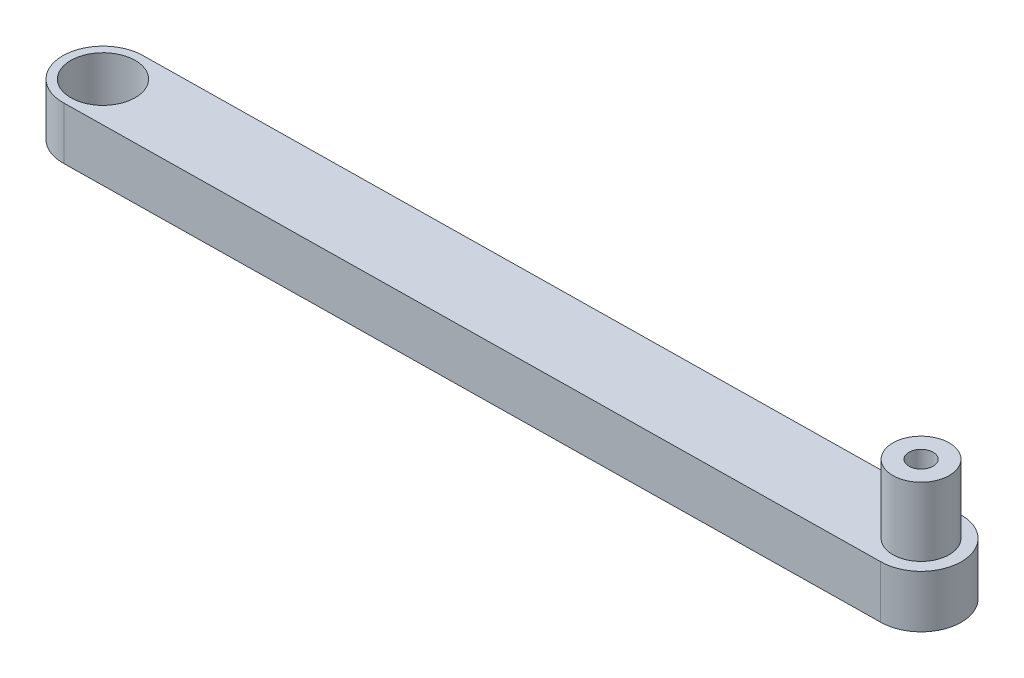
ISO-10303-21;
HEADER;
FILE_DESCRIPTION(('STEP AP214'),'2;1');
FILE_NAME('part.step','',(''),(''),'','','');
FILE_SCHEMA(('AUTOMOTIVE_DESIGN { 1 0 10303 214 1 1 1 1 }'));
ENDSEC;
DATA;
#1=APPLICATION_CONTEXT('core data for automotive mechanical design processes');
#2=APPLICATION_PROTOCOL_DEFINITION('international standard','automotive_design',2000,#1);
#3=PRODUCT_CONTEXT('',#1,'mechanical');
#4=PRODUCT('Part','Part','',(#3));
#5=PRODUCT_RELATED_PRODUCT_CATEGORY('part','',(#4));
#6=PRODUCT_DEFINITION_FORMATION('','',#4);
#7=PRODUCT_DEFINITION_CONTEXT('part definition',#1,'design');
#8=PRODUCT_DEFINITION('design','',#6,#7);
#9=PRODUCT_DEFINITION_SHAPE('','',#8);
#10=(LENGTH_UNIT() NAMED_UNIT(*) SI_UNIT(.MILLI.,.METRE.));
#11=(NAMED_UNIT(*) PLANE_ANGLE_UNIT() SI_UNIT($,.RADIAN.));
#12=(NAMED_UNIT(*) SI_UNIT($,.STERADIAN.) SOLID_ANGLE_UNIT());
#13=UNCERTAINTY_MEASURE_WITH_UNIT(LENGTH_MEASURE(1.E-05),#10,'distance_accuracy_value','');
#14=(GEOMETRIC_REPRESENTATION_CONTEXT(3) GLOBAL_UNCERTAINTY_ASSIGNED_CONTEXT((#13)) GLOBAL_UNIT_ASSIGNED_CONTEXT((#10,
#11,#12)) REPRESENTATION_CONTEXT('',''));
#15=CARTESIAN_POINT('',(0.,0.,0.));
#16=DIRECTION('',(0.,0.,1.));
#17=DIRECTION('',(1.,0.,0.));
#18=AXIS2_PLACEMENT_3D('',#15,#16,#17);
#19=CARTESIAN_POINT('',(99.9903473249566,6.5,-1.38940340957594));
#20=DIRECTION('',(0.,-1.,0.));
#21=DIRECTION('',(0.,0.,-1.));
#22=AXIS2_PLACEMENT_3D('',#19,#20,#21);
#23=CYLINDRICAL_SURFACE('',#22,5.);
#24=CARTESIAN_POINT('',(99.9903473249566,0.,-1.38940340957594));
#25=DIRECTION('',(0.,1.,0.));
#26=DIRECTION('',(0.,0.,1.));
#27=AXIS2_PLACEMENT_3D('',#24,#25,#26);
#28=CIRCLE('',#27,5.);
#29=CARTESIAN_POINT('',(99.9903473249566,0.,3.61059659042407));
#30=VERTEX_POINT('',#29);
#31=CARTESIAN_POINT('',(99.9903473249566,0.,-6.38940340957594));
#32=VERTEX_POINT('',#31);
#33=EDGE_CURVE('E133',#30,#32,#28,.T.);
#34=ORIENTED_EDGE('',*,*,#33,.T.);
#35=DIRECTION('',(0.,-1.,0.));
#36=VECTOR('',#35,1.);
#37=CARTESIAN_POINT('',(99.9903473249566,6.5,-6.38940340957594));
#38=LINE('',#37,#36);
#39=CARTESIAN_POINT('',(99.9903473249566,6.5,-6.38940340957594));
#40=VERTEX_POINT('',#39);
#41=EDGE_CURVE('E87',#40,#32,#38,.T.);
#42=ORIENTED_EDGE('',*,*,#41,.F.);
#43=CARTESIAN_POINT('',(99.9903473249566,6.5,-1.38940340957594));
#44=DIRECTION('',(0.,1.,0.));
#45=DIRECTION('',(0.,0.,1.));
#46=AXIS2_PLACEMENT_3D('',#43,#44,#45);
#47=CIRCLE('',#46,5.);
#48=CARTESIAN_POINT('',(99.9903473249566,6.5,3.61059659042407));
#49=VERTEX_POINT('',#48);
#50=EDGE_CURVE('E121',#49,#40,#47,.T.);
#51=ORIENTED_EDGE('',*,*,#50,.F.);
#52=DIRECTION('',(0.,-1.,0.));
#53=VECTOR('',#52,1.);
#54=CARTESIAN_POINT('',(99.9903473249566,6.5,3.61059659042407));
#55=LINE('',#54,#53);
#56=EDGE_CURVE('E12',#49,#30,#55,.T.);
#57=ORIENTED_EDGE('',*,*,#56,.T.);
#58=EDGE_LOOP('',(#34,#42,#51,#57));
#59=FACE_BOUND('',#58,.T.);
#60=ADVANCED_FACE('F77',(#59),#23,.T.);
#61=CARTESIAN_POINT('',(-0.0694634647489887,6.5,-4.99903477908273));
#62=DIRECTION('',(-0.0138940340957594,0.,-0.999903473249566));
#63=DIRECTION('',(-0.999903473249566,0.,0.0138940340957594));
#64=AXIS2_PLACEMENT_3D('',#61,#62,#63);
#65=PLANE('',#64);
#66=DIRECTION('',(0.999903473249566,0.,-0.0138940340957594));
#67=VECTOR('',#66,1.);
#68=CARTESIAN_POINT('',(-0.0694634647489887,0.,-4.99903477908273));
#69=LINE('',#68,#67);
#70=CARTESIAN_POINT('',(0.,0.,-5.));
#71=VERTEX_POINT('',#70);
#72=EDGE_CURVE('E147',#71,#32,#69,.T.);
#73=ORIENTED_EDGE('',*,*,#72,.F.);
#74=DIRECTION('',(0.,-1.,0.));
#75=VECTOR('',#74,1.);
#76=CARTESIAN_POINT('',(0.,6.5,-5.));
#77=LINE('',#76,#75);
#78=CARTESIAN_POINT('',(0.,6.5,-5.));
#79=VERTEX_POINT('',#78);
#80=EDGE_CURVE('E110',#79,#71,#77,.T.);
#81=ORIENTED_EDGE('',*,*,#80,.F.);
#82=DIRECTION('',(0.999903473249566,0.,-0.0138940340957594));
#83=VECTOR('',#82,1.);
#84=CARTESIAN_POINT('',(-0.0694634647489887,6.5,-4.99903477908273));
#85=LINE('',#84,#83);
#86=EDGE_CURVE('E128',#79,#40,#85,.T.);
#87=ORIENTED_EDGE('',*,*,#86,.T.);
#88=ORIENTED_EDGE('',*,*,#41,.T.);
#89=EDGE_LOOP('',(#73,#81,#87,#88));
#90=FACE_BOUND('',#89,.T.);
#91=ADVANCED_FACE('F138',(#90),#65,.T.);
#92=CARTESIAN_POINT('',(0.0694634647489882,6.5,4.99903477908273));
#93=DIRECTION('',(-0.0138940340957593,0.,-0.999903473249566));
#94=DIRECTION('',(-0.999903473249566,0.,0.0138940340957593));
#95=AXIS2_PLACEMENT_3D('',#92,#93,#94);
#96=PLANE('',#95);
#97=DIRECTION('',(0.999903473249566,0.,-0.0138940340957593));
#98=VECTOR('',#97,1.);
#99=CARTESIAN_POINT('',(0.0694634647489882,0.,4.99903477908273));
#100=LINE('',#99,#98);
#101=CARTESIAN_POINT('',(0.138926929497962,0.,4.99806955816546));
#102=VERTEX_POINT('',#101);
#103=EDGE_CURVE('E143',#102,#30,#100,.T.);
#104=ORIENTED_EDGE('',*,*,#103,.T.);
#105=ORIENTED_EDGE('',*,*,#56,.F.);
#106=DIRECTION('',(0.999903473249566,0.,-0.0138940340957593));
#107=VECTOR('',#106,1.);
#108=CARTESIAN_POINT('',(0.0694634647489882,6.5,4.99903477908273));
#109=LINE('',#108,#107);
#110=CARTESIAN_POINT('',(0.138926929497962,6.5,4.99806955816546));
#111=VERTEX_POINT('',#110);
#112=EDGE_CURVE('E129',#111,#49,#109,.T.);
#113=ORIENTED_EDGE('',*,*,#112,.F.);
#114=DIRECTION('',(0.,-1.,0.));
#115=VECTOR('',#114,1.);
#116=CARTESIAN_POINT('',(0.138926929497962,6.5,4.99806955816546));
#117=LINE('',#116,#115);
#118=EDGE_CURVE('E96',#111,#102,#117,.T.);
#119=ORIENTED_EDGE('',*,*,#118,.T.);
#120=EDGE_LOOP('',(#104,#105,#113,#119));
#121=FACE_BOUND('',#120,.T.);
#122=ADVANCED_FACE('F160',(#121),#96,.F.);
#123=CARTESIAN_POINT('',(0.,0.,0.));
#124=DIRECTION('',(0.,1.,0.));
#125=DIRECTION('',(0.,0.,1.));
#126=AXIS2_PLACEMENT_3D('',#123,#124,#125);
#127=PLANE('',#126);
#128=CARTESIAN_POINT('',(99.9903473249566,0.,-1.38940340957594));
#129=DIRECTION('',(0.,1.,0.));
#130=DIRECTION('',(0.,0.,1.));
#131=AXIS2_PLACEMENT_3D('',#128,#129,#130);
#132=CIRCLE('',#131,1.5);
#133=CARTESIAN_POINT('',(99.9903473249566,0.,0.11059659042406));
#134=VERTEX_POINT('',#133);
#135=EDGE_CURVE('E165',#134,#134,#132,.T.);
#136=ORIENTED_EDGE('',*,*,#135,.T.);
#137=EDGE_LOOP('',(#136));
#138=FACE_BOUND('',#137,.T.);
#139=ORIENTED_EDGE('',*,*,#103,.F.);
#140=CARTESIAN_POINT('',(0.,0.,0.));
#141=DIRECTION('',(0.,1.,0.));
#142=DIRECTION('',(0.,0.,1.));
#143=AXIS2_PLACEMENT_3D('',#140,#141,#142);
#144=CIRCLE('',#143,5.);
#145=EDGE_CURVE('E81',#71,#102,#144,.T.);
#146=ORIENTED_EDGE('',*,*,#145,.F.);
#147=ORIENTED_EDGE('',*,*,#72,.T.);
#148=ORIENTED_EDGE('',*,*,#33,.F.);
#149=EDGE_LOOP('',(#139,#146,#147,#148));
#150=FACE_BOUND('',#149,.T.);
#151=CARTESIAN_POINT('',(0.,0.,0.));
#152=DIRECTION('',(0.,1.,0.));
#153=DIRECTION('',(0.,0.,1.));
#154=AXIS2_PLACEMENT_3D('',#151,#152,#153);
#155=CIRCLE('',#154,4.);
#156=CARTESIAN_POINT('',(0.,0.,-4.));
#157=VERTEX_POINT('',#156);
#158=EDGE_CURVE('E153',#157,#157,#155,.T.);
#159=ORIENTED_EDGE('',*,*,#158,.T.);
#160=EDGE_LOOP('',(#159));
#161=FACE_BOUND('',#160,.T.);
#162=ADVANCED_FACE('F158',(#138,#150,#161),#127,.F.);
#163=CARTESIAN_POINT('',(0.,6.5,0.));
#164=DIRECTION('',(0.,1.,0.));
#165=DIRECTION('',(0.,0.,1.));
#166=AXIS2_PLACEMENT_3D('',#163,#164,#165);
#167=PLANE('',#166);
#168=CARTESIAN_POINT('',(99.9903473249566,6.5,-1.38940340957594));
#169=DIRECTION('',(0.,1.,0.));
#170=DIRECTION('',(0.,0.,1.));
#171=AXIS2_PLACEMENT_3D('',#168,#169,#170);
#172=CIRCLE('',#171,3.49999999999999);
#173=CARTESIAN_POINT('',(99.9903473249566,6.5,2.11059659042406));
#174=VERTEX_POINT('',#173);
#175=EDGE_CURVE('E162',#174,#174,#172,.T.);
#176=ORIENTED_EDGE('',*,*,#175,.F.);
#177=EDGE_LOOP('',(#176));
#178=FACE_BOUND('',#177,.T.);
#179=ORIENTED_EDGE('',*,*,#112,.T.);
#180=ORIENTED_EDGE('',*,*,#50,.T.);
#181=ORIENTED_EDGE('',*,*,#86,.F.);
#182=CARTESIAN_POINT('',(0.,6.5,0.));
#183=DIRECTION('',(0.,1.,0.));
#184=DIRECTION('',(0.,0.,1.));
#185=AXIS2_PLACEMENT_3D('',#182,#183,#184);
#186=CIRCLE('',#185,5.);
#187=EDGE_CURVE('E145',#79,#111,#186,.T.);
#188=ORIENTED_EDGE('',*,*,#187,.T.);
#189=EDGE_LOOP('',(#179,#180,#181,#188));
#190=FACE_BOUND('',#189,.T.);
#191=CARTESIAN_POINT('',(0.,6.5,0.));
#192=DIRECTION('',(0.,1.,0.));
#193=DIRECTION('',(0.,0.,1.));
#194=AXIS2_PLACEMENT_3D('',#191,#192,#193);
#195=CIRCLE('',#194,4.);
#196=CARTESIAN_POINT('',(0.,6.5,-4.));
#197=VERTEX_POINT('',#196);
#198=EDGE_CURVE('E150',#197,#197,#195,.T.);
#199=ORIENTED_EDGE('',*,*,#198,.F.);
#200=EDGE_LOOP('',(#199));
#201=FACE_BOUND('',#200,.T.);
#202=ADVANCED_FACE('F125',(#178,#190,#201),#167,.T.);
#203=CARTESIAN_POINT('',(0.,6.5,0.));
#204=DIRECTION('',(0.,-1.,0.));
#205=DIRECTION('',(0.,0.,-1.));
#206=AXIS2_PLACEMENT_3D('',#203,#204,#205);
#207=CYLINDRICAL_SURFACE('',#206,4.);
#208=CARTESIAN_POINT('',(0.,6.5,-4.));
#209=CARTESIAN_POINT('',(0.,6.43229166666667,-4.));
#210=CARTESIAN_POINT('',(0.,6.36458333333333,-4.));
#211=CARTESIAN_POINT('',(0.,6.22916666666667,-4.));
#212=CARTESIAN_POINT('',(0.,6.16145833333333,-4.));
#213=CARTESIAN_POINT('',(0.,6.02604166666667,-4.));
#214=CARTESIAN_POINT('',(0.,5.95833333333333,-4.));
#215=CARTESIAN_POINT('',(0.,5.82291666666667,-4.));
#216=CARTESIAN_POINT('',(0.,5.75520833333333,-4.));
#217=CARTESIAN_POINT('',(0.,5.61979166666667,-4.));
#218=CARTESIAN_POINT('',(0.,5.55208333333333,-4.));
#219=CARTESIAN_POINT('',(0.,5.41666666666667,-4.));
#220=CARTESIAN_POINT('',(0.,5.34895833333333,-4.));
#221=CARTESIAN_POINT('',(0.,5.21354166666667,-4.));
#222=CARTESIAN_POINT('',(0.,5.14583333333333,-4.));
#223=CARTESIAN_POINT('',(0.,5.01041666666667,-4.));
#224=CARTESIAN_POINT('',(0.,4.94270833333333,-4.));
#225=CARTESIAN_POINT('',(0.,4.80729166666667,-4.));
#226=CARTESIAN_POINT('',(0.,4.73958333333333,-4.));
#227=CARTESIAN_POINT('',(0.,4.60416666666667,-4.));
#228=CARTESIAN_POINT('',(0.,4.53645833333333,-4.));
#229=CARTESIAN_POINT('',(0.,4.40104166666667,-4.));
#230=CARTESIAN_POINT('',(0.,4.33333333333333,-4.));
#231=CARTESIAN_POINT('',(0.,4.19791666666667,-4.));
#232=CARTESIAN_POINT('',(0.,4.13020833333333,-4.));
#233=CARTESIAN_POINT('',(0.,3.99479166666667,-4.));
#234=CARTESIAN_POINT('',(0.,3.92708333333333,-4.));
#235=CARTESIAN_POINT('',(0.,3.79166666666667,-4.));
#236=CARTESIAN_POINT('',(0.,3.72395833333333,-4.));
#237=CARTESIAN_POINT('',(0.,3.58854166666667,-4.));
#238=CARTESIAN_POINT('',(0.,3.52083333333333,-4.));
#239=CARTESIAN_POINT('',(0.,3.38541666666667,-4.));
#240=CARTESIAN_POINT('',(0.,3.31770833333333,-4.));
#241=CARTESIAN_POINT('',(0.,3.18229166666667,-4.));
#242=CARTESIAN_POINT('',(0.,3.11458333333333,-4.));
#243=CARTESIAN_POINT('',(0.,2.97916666666667,-4.));
#244=CARTESIAN_POINT('',(0.,2.91145833333333,-4.));
#245=CARTESIAN_POINT('',(0.,2.77604166666667,-4.));
#246=CARTESIAN_POINT('',(0.,2.70833333333333,-4.));
#247=CARTESIAN_POINT('',(0.,2.57291666666667,-4.));
#248=CARTESIAN_POINT('',(0.,2.50520833333333,-4.));
#249=CARTESIAN_POINT('',(0.,2.36979166666667,-4.));
#250=CARTESIAN_POINT('',(0.,2.30208333333333,-4.));
#251=CARTESIAN_POINT('',(0.,2.16666666666667,-4.));
#252=CARTESIAN_POINT('',(0.,2.09895833333333,-4.));
#253=CARTESIAN_POINT('',(0.,1.96354166666667,-4.));
#254=CARTESIAN_POINT('',(0.,1.89583333333333,-4.));
#255=CARTESIAN_POINT('',(0.,1.76041666666667,-4.));
#256=CARTESIAN_POINT('',(0.,1.69270833333333,-4.));
#257=CARTESIAN_POINT('',(0.,1.55729166666667,-4.));
#258=CARTESIAN_POINT('',(0.,1.48958333333333,-4.));
#259=CARTESIAN_POINT('',(0.,1.35416666666667,-4.));
#260=CARTESIAN_POINT('',(0.,1.28645833333333,-4.));
#261=CARTESIAN_POINT('',(0.,1.15104166666667,-4.));
#262=CARTESIAN_POINT('',(0.,1.08333333333333,-4.));
#263=CARTESIAN_POINT('',(0.,0.947916666666667,-4.));
#264=CARTESIAN_POINT('',(0.,0.880208333333333,-4.));
#265=CARTESIAN_POINT('',(0.,0.744791666666667,-4.));
#266=CARTESIAN_POINT('',(0.,0.677083333333333,-4.));
#267=CARTESIAN_POINT('',(0.,0.541666666666667,-4.));
#268=CARTESIAN_POINT('',(0.,0.473958333333333,-4.));
#269=CARTESIAN_POINT('',(0.,0.338541666666667,-4.));
#270=CARTESIAN_POINT('',(0.,0.270833333333334,-4.));
#271=CARTESIAN_POINT('',(0.,0.135416666666667,-4.));
#272=CARTESIAN_POINT('',(0.,0.0677083333333334,-4.));
#273=CARTESIAN_POINT('',(0.,0.,-4.));
#274=B_SPLINE_CURVE_WITH_KNOTS('',3,(#208,#209,#210,#211,#212,#213,#214,#215,#216,#217,#218,
#219,#220,#221,#222,#223,#224,#225,#226,#227,#228,#229,#230,#231,#232,#233,#234,#235,#236,#237,
#238,#239,#240,#241,#242,#243,#244,#245,#246,#247,#248,#249,#250,#251,#252,#253,#254,#255,#256,
#257,#258,#259,#260,#261,#262,#263,#264,#265,#266,#267,#268,#269,#270,#271,#272,#273),
.UNSPECIFIED.,.F.,.F.,(4,2,2,2,2,2,2,2,2,2,2,2,2,2,2,2,2,2,2,2,2,2,2,2,2,2,2,2,2,2,2,2,4),(0.,
0.203125,0.40625,0.609375000000001,0.812500000000001,1.015625,1.21875,1.421875,1.625,1.828125,
2.03125,2.234375,2.4375,2.640625,2.84375,3.046875,3.25,3.453125,3.65625,3.859375,4.0625,
4.265625,4.46875,4.671875,4.875,5.078125,5.28125,5.484375,5.6875,5.890625,6.09375,6.296875,6.5),.UNSPECIFIED.);
#275=EDGE_CURVE('BSEAM191',#197,#157,#274,.T.);
#276=ORIENTED_EDGE('',*,*,#198,.T.);
#277=ORIENTED_EDGE('',*,*,#158,.F.);
#278=ORIENTED_EDGE('',*,*,#275,.T.);
#279=ORIENTED_EDGE('',*,*,#275,.F.);
#280=EDGE_LOOP('',(#276,#278,#277,#279));
#281=FACE_BOUND('',#280,.T.);
#282=ADVANCED_FACE('F191',(#281),#207,.F.);
#283=CARTESIAN_POINT('',(0.,6.5,0.));
#284=DIRECTION('',(0.,-1.,0.));
#285=DIRECTION('',(0.,0.,-1.));
#286=AXIS2_PLACEMENT_3D('',#283,#284,#285);
#287=CYLINDRICAL_SURFACE('',#286,5.);
#288=ORIENTED_EDGE('',*,*,#145,.T.);
#289=ORIENTED_EDGE('',*,*,#118,.F.);
#290=ORIENTED_EDGE('',*,*,#187,.F.);
#291=ORIENTED_EDGE('',*,*,#80,.T.);
#292=EDGE_LOOP('',(#288,#289,#290,#291));
#293=FACE_BOUND('',#292,.T.);
#294=ADVANCED_FACE('F79',(#293),#287,.T.);
#295=CARTESIAN_POINT('',(99.9903473249566,15.,-1.38940340957594));
#296=DIRECTION('',(0.,-1.,0.));
#297=DIRECTION('',(0.,0.,-1.));
#298=AXIS2_PLACEMENT_3D('',#295,#296,#297);
#299=CYLINDRICAL_SURFACE('',#298,3.49999999999999);
#300=CARTESIAN_POINT('',(99.9903473249566,15.,-1.38940340957594));
#301=DIRECTION('',(0.,1.,0.));
#302=DIRECTION('',(0.,0.,1.));
#303=AXIS2_PLACEMENT_3D('',#300,#301,#302);
#304=CIRCLE('',#303,3.49999999999999);
#305=CARTESIAN_POINT('',(99.9903473249566,15.,2.11059659042406));
#306=VERTEX_POINT('',#305);
#307=EDGE_CURVE('E155',#306,#306,#304,.T.);
#308=ORIENTED_EDGE('',*,*,#307,.F.);
#309=EDGE_LOOP('',(#308));
#310=FACE_BOUND('',#309,.T.);
#311=ORIENTED_EDGE('',*,*,#175,.T.);
#312=EDGE_LOOP('',(#311));
#313=FACE_BOUND('',#312,.T.);
#314=ADVANCED_FACE('F184',(#310,#313),#299,.T.);
#315=CARTESIAN_POINT('',(99.9903473249566,15.,-1.38940340957594));
#316=DIRECTION('',(0.,1.,0.));
#317=DIRECTION('',(0.,0.,1.));
#318=AXIS2_PLACEMENT_3D('',#315,#316,#317);
#319=PLANE('',#318);
#320=CARTESIAN_POINT('',(99.9903473249566,15.,-1.38940340957594));
#321=DIRECTION('',(0.,1.,0.));
#322=DIRECTION('',(0.,0.,1.));
#323=AXIS2_PLACEMENT_3D('',#320,#321,#322);
#324=CIRCLE('',#323,1.5);
#325=CARTESIAN_POINT('',(99.9903473249566,15.,0.11059659042406));
#326=VERTEX_POINT('',#325);
#327=EDGE_CURVE('E168',#326,#326,#324,.T.);
#328=ORIENTED_EDGE('',*,*,#327,.F.);
#329=EDGE_LOOP('',(#328));
#330=FACE_BOUND('',#329,.T.);
#331=ORIENTED_EDGE('',*,*,#307,.T.);
#332=EDGE_LOOP('',(#331));
#333=FACE_BOUND('',#332,.T.);
#334=ADVANCED_FACE('F178',(#330,#333),#319,.T.);
#335=CARTESIAN_POINT('',(99.9903473249566,0.,-1.38940340957594));
#336=DIRECTION('',(0.,1.,0.));
#337=DIRECTION('',(0.,0.,1.));
#338=AXIS2_PLACEMENT_3D('',#335,#336,#337);
#339=CYLINDRICAL_SURFACE('',#338,1.5);
#340=ORIENTED_EDGE('',*,*,#135,.F.);
#341=EDGE_LOOP('',(#340));
#342=FACE_BOUND('',#341,.T.);
#343=ORIENTED_EDGE('',*,*,#327,.T.);
#344=EDGE_LOOP('',(#343));
#345=FACE_BOUND('',#344,.T.);
#346=ADVANCED_FACE('F175',(#342,#345),#339,.F.);
#347=CLOSED_SHELL('',(#60,#91,#122,#162,#202,#282,#294,#314,#334,#346));
#348=MANIFOLD_SOLID_BREP('B2',#347);
#349=ADVANCED_BREP_SHAPE_REPRESENTATION('',(#18,#348),#14);
#350=SHAPE_DEFINITION_REPRESENTATION(#9,#349);
ENDSEC;
END-ISO-10303-21;
